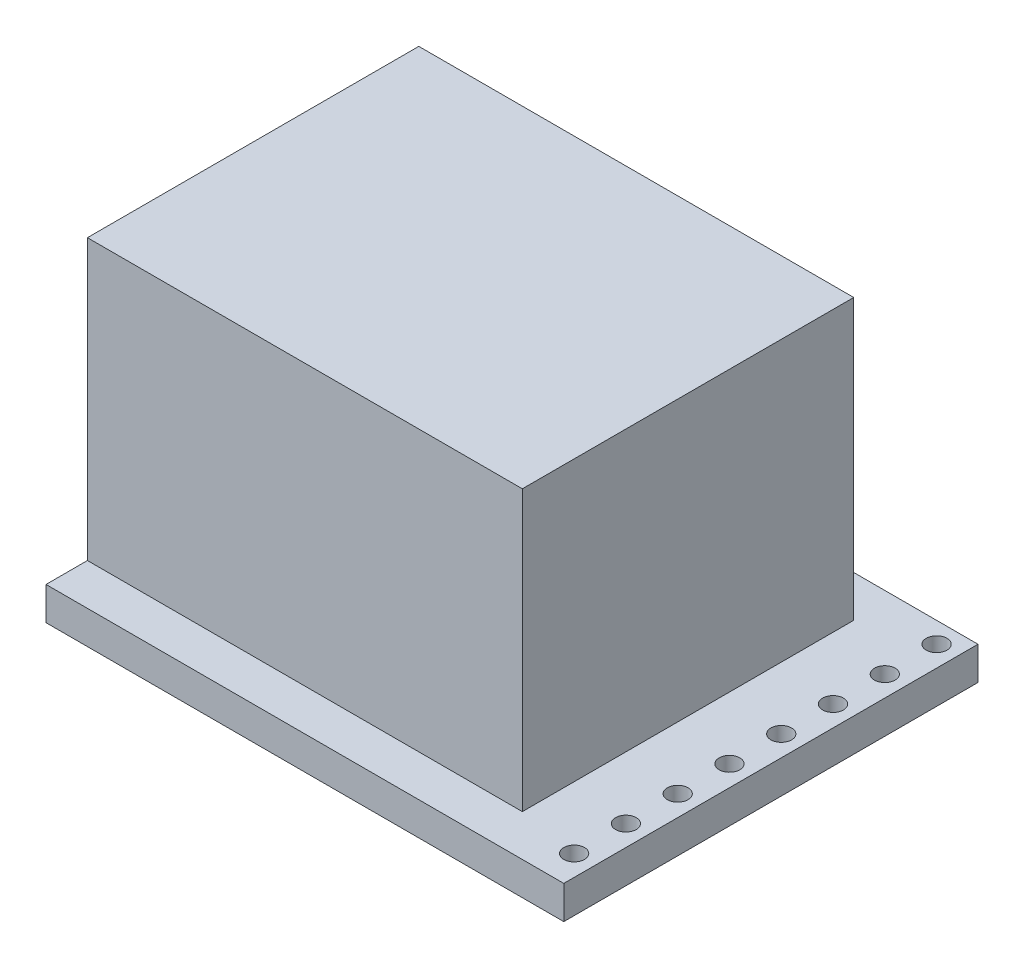
ISO-10303-21;
HEADER;
FILE_DESCRIPTION(('STEP AP214'),'2;1');
FILE_NAME('part.step','',(''),(''),'','','');
FILE_SCHEMA(('AUTOMOTIVE_DESIGN { 1 0 10303 214 1 1 1 1 }'));
ENDSEC;
DATA;
#1=APPLICATION_CONTEXT('core data for automotive mechanical design processes');
#2=APPLICATION_PROTOCOL_DEFINITION('international standard','automotive_design',2000,#1);
#3=PRODUCT_CONTEXT('',#1,'mechanical');
#4=PRODUCT('Part','Part','',(#3));
#5=PRODUCT_RELATED_PRODUCT_CATEGORY('part','',(#4));
#6=PRODUCT_DEFINITION_FORMATION('','',#4);
#7=PRODUCT_DEFINITION_CONTEXT('part definition',#1,'design');
#8=PRODUCT_DEFINITION('design','',#6,#7);
#9=PRODUCT_DEFINITION_SHAPE('','',#8);
#10=(LENGTH_UNIT() NAMED_UNIT(*) SI_UNIT(.MILLI.,.METRE.));
#11=(NAMED_UNIT(*) PLANE_ANGLE_UNIT() SI_UNIT($,.RADIAN.));
#12=(NAMED_UNIT(*) SI_UNIT($,.STERADIAN.) SOLID_ANGLE_UNIT());
#13=UNCERTAINTY_MEASURE_WITH_UNIT(LENGTH_MEASURE(1.E-05),#10,'distance_accuracy_value','');
#14=(GEOMETRIC_REPRESENTATION_CONTEXT(3) GLOBAL_UNCERTAINTY_ASSIGNED_CONTEXT((#13)) GLOBAL_UNIT_ASSIGNED_CONTEXT((#10,
#11,#12)) REPRESENTATION_CONTEXT('',''));
#15=CARTESIAN_POINT('',(0.,0.,0.));
#16=DIRECTION('',(0.,0.,1.));
#17=DIRECTION('',(1.,0.,0.));
#18=AXIS2_PLACEMENT_3D('',#15,#16,#17);
#19=CARTESIAN_POINT('',(0.,0.,0.));
#20=DIRECTION('',(0.,-1.,0.));
#21=DIRECTION('',(0.,0.,-1.));
#22=AXIS2_PLACEMENT_3D('',#19,#20,#21);
#23=PLANE('',#22);
#24=CARTESIAN_POINT('',(11.5000000000001,0.,-8.99999999999995));
#25=DIRECTION('',(0.,1.,0.));
#26=DIRECTION('',(0.,0.,1.));
#27=AXIS2_PLACEMENT_3D('',#24,#25,#26);
#28=CIRCLE('',#27,0.500000000000001);
#29=CARTESIAN_POINT('',(11.5000000000001,0.,-8.49999999999995));
#30=VERTEX_POINT('',#29);
#31=EDGE_CURVE('E212',#30,#30,#28,.T.);
#32=ORIENTED_EDGE('',*,*,#31,.F.);
#33=EDGE_LOOP('',(#32));
#34=FACE_BOUND('',#33,.T.);
#35=CARTESIAN_POINT('',(11.5000000000001,0.,-6.49999999999995));
#36=DIRECTION('',(0.,1.,0.));
#37=DIRECTION('',(0.,0.,1.));
#38=AXIS2_PLACEMENT_3D('',#35,#36,#37);
#39=CIRCLE('',#38,0.500000000000001);
#40=CARTESIAN_POINT('',(11.5000000000001,0.,-5.99999999999995));
#41=VERTEX_POINT('',#40);
#42=EDGE_CURVE('E216',#41,#41,#39,.T.);
#43=ORIENTED_EDGE('',*,*,#42,.F.);
#44=EDGE_LOOP('',(#43));
#45=FACE_BOUND('',#44,.T.);
#46=CARTESIAN_POINT('',(11.5000000000001,0.,-3.99999999999995));
#47=DIRECTION('',(0.,1.,0.));
#48=DIRECTION('',(0.,0.,1.));
#49=AXIS2_PLACEMENT_3D('',#46,#47,#48);
#50=CIRCLE('',#49,0.500000000000001);
#51=CARTESIAN_POINT('',(11.5000000000001,0.,-3.49999999999995));
#52=VERTEX_POINT('',#51);
#53=EDGE_CURVE('E219',#52,#52,#50,.T.);
#54=ORIENTED_EDGE('',*,*,#53,.F.);
#55=EDGE_LOOP('',(#54));
#56=FACE_BOUND('',#55,.T.);
#57=CARTESIAN_POINT('',(11.5000000000001,0.,-1.49999999999995));
#58=DIRECTION('',(0.,1.,0.));
#59=DIRECTION('',(0.,0.,1.));
#60=AXIS2_PLACEMENT_3D('',#57,#58,#59);
#61=CIRCLE('',#60,0.500000000000001);
#62=CARTESIAN_POINT('',(11.5000000000001,0.,-0.999999999999952));
#63=VERTEX_POINT('',#62);
#64=EDGE_CURVE('E222',#63,#63,#61,.T.);
#65=ORIENTED_EDGE('',*,*,#64,.F.);
#66=EDGE_LOOP('',(#65));
#67=FACE_BOUND('',#66,.T.);
#68=CARTESIAN_POINT('',(11.5000000000002,0.,1.00000000000005));
#69=DIRECTION('',(0.,1.,0.));
#70=DIRECTION('',(0.,0.,1.));
#71=AXIS2_PLACEMENT_3D('',#68,#69,#70);
#72=CIRCLE('',#71,0.500000000000001);
#73=CARTESIAN_POINT('',(11.5000000000002,0.,1.50000000000005));
#74=VERTEX_POINT('',#73);
#75=EDGE_CURVE('E225',#74,#74,#72,.T.);
#76=ORIENTED_EDGE('',*,*,#75,.F.);
#77=EDGE_LOOP('',(#76));
#78=FACE_BOUND('',#77,.T.);
#79=CARTESIAN_POINT('',(11.5000000000002,0.,3.50000000000005));
#80=DIRECTION('',(0.,1.,0.));
#81=DIRECTION('',(0.,0.,1.));
#82=AXIS2_PLACEMENT_3D('',#79,#80,#81);
#83=CIRCLE('',#82,0.500000000000001);
#84=CARTESIAN_POINT('',(11.5000000000002,0.,4.00000000000005));
#85=VERTEX_POINT('',#84);
#86=EDGE_CURVE('E228',#85,#85,#83,.T.);
#87=ORIENTED_EDGE('',*,*,#86,.F.);
#88=EDGE_LOOP('',(#87));
#89=FACE_BOUND('',#88,.T.);
#90=CARTESIAN_POINT('',(11.5000000000002,0.,6.00000000000005));
#91=DIRECTION('',(0.,1.,0.));
#92=DIRECTION('',(0.,0.,1.));
#93=AXIS2_PLACEMENT_3D('',#90,#91,#92);
#94=CIRCLE('',#93,0.500000000000001);
#95=CARTESIAN_POINT('',(11.5000000000002,0.,6.50000000000005));
#96=VERTEX_POINT('',#95);
#97=EDGE_CURVE('E206',#96,#96,#94,.T.);
#98=ORIENTED_EDGE('',*,*,#97,.F.);
#99=EDGE_LOOP('',(#98));
#100=FACE_BOUND('',#99,.T.);
#101=CARTESIAN_POINT('',(11.5000000000002,0.,8.50000000000005));
#102=DIRECTION('',(0.,1.,0.));
#103=DIRECTION('',(0.,0.,1.));
#104=AXIS2_PLACEMENT_3D('',#101,#102,#103);
#105=CIRCLE('',#104,0.500000000000001);
#106=CARTESIAN_POINT('',(11.5000000000002,0.,9.00000000000005));
#107=VERTEX_POINT('',#106);
#108=EDGE_CURVE('E203',#107,#107,#105,.T.);
#109=ORIENTED_EDGE('',*,*,#108,.F.);
#110=EDGE_LOOP('',(#109));
#111=FACE_BOUND('',#110,.T.);
#112=DIRECTION('',(-1.,0.,0.));
#113=VECTOR('',#112,1.);
#114=CARTESIAN_POINT('',(-12.4999999999999,0.,-8.));
#115=LINE('',#114,#113);
#116=CARTESIAN_POINT('',(8.50000000000006,0.,-8.));
#117=VERTEX_POINT('',#116);
#118=CARTESIAN_POINT('',(-12.4999999999999,0.,-8.));
#119=VERTEX_POINT('',#118);
#120=EDGE_CURVE('E302',#117,#119,#115,.T.);
#121=ORIENTED_EDGE('',*,*,#120,.F.);
#122=DIRECTION('',(0.,0.,-1.));
#123=VECTOR('',#122,1.);
#124=CARTESIAN_POINT('',(8.50000000000006,0.,-8.));
#125=LINE('',#124,#123);
#126=CARTESIAN_POINT('',(8.50000000000006,0.,8.));
#127=VERTEX_POINT('',#126);
#128=EDGE_CURVE('E311',#127,#117,#125,.T.);
#129=ORIENTED_EDGE('',*,*,#128,.F.);
#130=DIRECTION('',(1.,0.,0.));
#131=VECTOR('',#130,1.);
#132=CARTESIAN_POINT('',(-12.4999999999999,0.,8.));
#133=LINE('',#132,#131);
#134=CARTESIAN_POINT('',(-12.4999999999999,0.,8.));
#135=VERTEX_POINT('',#134);
#136=EDGE_CURVE('E283',#135,#127,#133,.T.);
#137=ORIENTED_EDGE('',*,*,#136,.F.);
#138=DIRECTION('',(0.,0.,1.));
#139=VECTOR('',#138,1.);
#140=CARTESIAN_POINT('',(-12.4999999999999,0.,10.0000000000001));
#141=LINE('',#140,#139);
#142=CARTESIAN_POINT('',(-12.4999999999999,0.,10.0000000000001));
#143=VERTEX_POINT('',#142);
#144=EDGE_CURVE('E347',#135,#143,#141,.T.);
#145=ORIENTED_EDGE('',*,*,#144,.T.);
#146=DIRECTION('',(1.,0.,0.));
#147=VECTOR('',#146,1.);
#148=CARTESIAN_POINT('',(-12.4999999999999,0.,10.0000000000001));
#149=LINE('',#148,#147);
#150=CARTESIAN_POINT('',(12.5000000000001,0.,10.0000000000001));
#151=VERTEX_POINT('',#150);
#152=EDGE_CURVE('E332',#143,#151,#149,.T.);
#153=ORIENTED_EDGE('',*,*,#152,.T.);
#154=DIRECTION('',(0.,0.,-1.));
#155=VECTOR('',#154,1.);
#156=CARTESIAN_POINT('',(12.5000000000001,0.,10.0000000000001));
#157=LINE('',#156,#155);
#158=CARTESIAN_POINT('',(12.5000000000001,0.,-9.99999999999995));
#159=VERTEX_POINT('',#158);
#160=EDGE_CURVE('E327',#151,#159,#157,.T.);
#161=ORIENTED_EDGE('',*,*,#160,.T.);
#162=DIRECTION('',(-1.,0.,0.));
#163=VECTOR('',#162,1.);
#164=CARTESIAN_POINT('',(-12.4999999999999,0.,-9.99999999999995));
#165=LINE('',#164,#163);
#166=CARTESIAN_POINT('',(-12.4999999999999,0.,-9.99999999999995));
#167=VERTEX_POINT('',#166);
#168=EDGE_CURVE('E344',#159,#167,#165,.T.);
#169=ORIENTED_EDGE('',*,*,#168,.T.);
#170=EDGE_CURVE('E348',#167,#119,#141,.T.);
#171=ORIENTED_EDGE('',*,*,#170,.T.);
#172=EDGE_LOOP('',(#121,#129,#137,#145,#153,#161,#169,#171));
#173=FACE_BOUND('',#172,.T.);
#174=ADVANCED_FACE('F45',(#34,#45,#56,#67,#78,#89,#100,#111,#173),#23,.F.);
#175=CARTESIAN_POINT('',(12.5000000000001,-1.6,10.0000000000001));
#176=DIRECTION('',(1.,0.,0.));
#177=DIRECTION('',(0.,0.,-1.));
#178=AXIS2_PLACEMENT_3D('',#175,#176,#177);
#179=PLANE('',#178);
#180=ORIENTED_EDGE('',*,*,#160,.F.);
#181=DIRECTION('',(0.,1.,0.));
#182=VECTOR('',#181,1.);
#183=CARTESIAN_POINT('',(12.5000000000001,-1.6,10.0000000000001));
#184=LINE('',#183,#182);
#185=CARTESIAN_POINT('',(12.5000000000001,-1.6,10.0000000000001));
#186=VERTEX_POINT('',#185);
#187=EDGE_CURVE('E11',#186,#151,#184,.T.);
#188=ORIENTED_EDGE('',*,*,#187,.F.);
#189=DIRECTION('',(0.,0.,-1.));
#190=VECTOR('',#189,1.);
#191=CARTESIAN_POINT('',(12.5000000000001,-1.6,10.0000000000001));
#192=LINE('',#191,#190);
#193=CARTESIAN_POINT('',(12.5000000000001,-1.6,-9.99999999999995));
#194=VERTEX_POINT('',#193);
#195=EDGE_CURVE('E328',#186,#194,#192,.T.);
#196=ORIENTED_EDGE('',*,*,#195,.T.);
#197=DIRECTION('',(0.,1.,0.));
#198=VECTOR('',#197,1.);
#199=CARTESIAN_POINT('',(12.5000000000001,-1.6,-9.99999999999995));
#200=LINE('',#199,#198);
#201=EDGE_CURVE('E341',#194,#159,#200,.T.);
#202=ORIENTED_EDGE('',*,*,#201,.T.);
#203=EDGE_LOOP('',(#180,#188,#196,#202));
#204=FACE_BOUND('',#203,.T.);
#205=ADVANCED_FACE('F47',(#204),#179,.T.);
#206=CARTESIAN_POINT('',(-12.4999999999999,-1.6,10.0000000000001));
#207=DIRECTION('',(0.,0.,1.));
#208=DIRECTION('',(1.,0.,0.));
#209=AXIS2_PLACEMENT_3D('',#206,#207,#208);
#210=PLANE('',#209);
#211=ORIENTED_EDGE('',*,*,#152,.F.);
#212=DIRECTION('',(0.,1.,0.));
#213=VECTOR('',#212,1.);
#214=CARTESIAN_POINT('',(-12.4999999999999,-1.6,10.0000000000001));
#215=LINE('',#214,#213);
#216=CARTESIAN_POINT('',(-12.4999999999999,-1.6,10.0000000000001));
#217=VERTEX_POINT('',#216);
#218=EDGE_CURVE('E54',#217,#143,#215,.T.);
#219=ORIENTED_EDGE('',*,*,#218,.F.);
#220=DIRECTION('',(1.,0.,0.));
#221=VECTOR('',#220,1.);
#222=CARTESIAN_POINT('',(-12.4999999999999,-1.6,10.0000000000001));
#223=LINE('',#222,#221);
#224=EDGE_CURVE('E338',#217,#186,#223,.T.);
#225=ORIENTED_EDGE('',*,*,#224,.T.);
#226=ORIENTED_EDGE('',*,*,#187,.T.);
#227=EDGE_LOOP('',(#211,#219,#225,#226));
#228=FACE_BOUND('',#227,.T.);
#229=ADVANCED_FACE('F410',(#228),#210,.T.);
#230=CARTESIAN_POINT('',(-12.4999999999999,-1.6,10.0000000000001));
#231=DIRECTION('',(-1.,0.,0.));
#232=DIRECTION('',(0.,0.,1.));
#233=AXIS2_PLACEMENT_3D('',#230,#231,#232);
#234=PLANE('',#233);
#235=DIRECTION('',(0.,1.,0.));
#236=VECTOR('',#235,1.);
#237=CARTESIAN_POINT('',(-12.4999999999999,3.75,6.2));
#238=LINE('',#237,#236);
#239=CARTESIAN_POINT('',(-12.4999999999999,3.75,6.2));
#240=VERTEX_POINT('',#239);
#241=CARTESIAN_POINT('',(-12.4999999999999,10.75,6.2));
#242=VERTEX_POINT('',#241);
#243=EDGE_CURVE('E259',#240,#242,#238,.T.);
#244=ORIENTED_EDGE('',*,*,#243,.F.);
#245=DIRECTION('',(0.,0.,1.));
#246=VECTOR('',#245,1.);
#247=CARTESIAN_POINT('',(-12.4999999999999,3.75,3.5));
#248=LINE('',#247,#246);
#249=CARTESIAN_POINT('',(-12.4999999999999,3.75,3.5));
#250=VERTEX_POINT('',#249);
#251=EDGE_CURVE('E237',#250,#240,#248,.T.);
#252=ORIENTED_EDGE('',*,*,#251,.F.);
#253=DIRECTION('',(0.,1.,0.));
#254=VECTOR('',#253,1.);
#255=CARTESIAN_POINT('',(-12.4999999999999,3.75,3.5));
#256=LINE('',#255,#254);
#257=CARTESIAN_POINT('',(-12.4999999999999,2.25,3.5));
#258=VERTEX_POINT('',#257);
#259=EDGE_CURVE('E276',#258,#250,#256,.T.);
#260=ORIENTED_EDGE('',*,*,#259,.F.);
#261=DIRECTION('',(0.,0.,1.));
#262=VECTOR('',#261,1.);
#263=CARTESIAN_POINT('',(-12.4999999999999,2.25,3.5));
#264=LINE('',#263,#262);
#265=CARTESIAN_POINT('',(-12.4999999999999,2.25,-3.5));
#266=VERTEX_POINT('',#265);
#267=EDGE_CURVE('E273',#266,#258,#264,.T.);
#268=ORIENTED_EDGE('',*,*,#267,.F.);
#269=DIRECTION('',(0.,-1.,0.));
#270=VECTOR('',#269,1.);
#271=CARTESIAN_POINT('',(-12.4999999999999,3.75,-3.5));
#272=LINE('',#271,#270);
#273=CARTESIAN_POINT('',(-12.4999999999999,3.75,-3.5));
#274=VERTEX_POINT('',#273);
#275=EDGE_CURVE('E270',#274,#266,#272,.T.);
#276=ORIENTED_EDGE('',*,*,#275,.F.);
#277=DIRECTION('',(0.,0.,1.));
#278=VECTOR('',#277,1.);
#279=CARTESIAN_POINT('',(-12.4999999999999,3.75,-6.2));
#280=LINE('',#279,#278);
#281=CARTESIAN_POINT('',(-12.4999999999999,3.75,-6.2));
#282=VERTEX_POINT('',#281);
#283=EDGE_CURVE('E267',#282,#274,#280,.T.);
#284=ORIENTED_EDGE('',*,*,#283,.F.);
#285=DIRECTION('',(0.,-1.,0.));
#286=VECTOR('',#285,1.);
#287=CARTESIAN_POINT('',(-12.4999999999999,3.75,-6.2));
#288=LINE('',#287,#286);
#289=CARTESIAN_POINT('',(-12.4999999999999,10.75,-6.2));
#290=VERTEX_POINT('',#289);
#291=EDGE_CURVE('E264',#290,#282,#288,.T.);
#292=ORIENTED_EDGE('',*,*,#291,.F.);
#293=DIRECTION('',(0.,0.,-1.));
#294=VECTOR('',#293,1.);
#295=CARTESIAN_POINT('',(-12.4999999999999,10.75,-6.2));
#296=LINE('',#295,#294);
#297=EDGE_CURVE('E261',#242,#290,#296,.T.);
#298=ORIENTED_EDGE('',*,*,#297,.F.);
#299=EDGE_LOOP('',(#244,#252,#260,#268,#276,#284,#292,#298));
#300=FACE_BOUND('',#299,.T.);
#301=ORIENTED_EDGE('',*,*,#170,.F.);
#302=DIRECTION('',(0.,1.,0.));
#303=VECTOR('',#302,1.);
#304=CARTESIAN_POINT('',(-12.4999999999999,-1.6,-9.99999999999995));
#305=LINE('',#304,#303);
#306=CARTESIAN_POINT('',(-12.4999999999999,-1.6,-9.99999999999995));
#307=VERTEX_POINT('',#306);
#308=EDGE_CURVE('E354',#307,#167,#305,.T.);
#309=ORIENTED_EDGE('',*,*,#308,.F.);
#310=DIRECTION('',(0.,0.,1.));
#311=VECTOR('',#310,1.);
#312=CARTESIAN_POINT('',(-12.4999999999999,-1.6,10.0000000000001));
#313=LINE('',#312,#311);
#314=EDGE_CURVE('E335',#307,#217,#313,.T.);
#315=ORIENTED_EDGE('',*,*,#314,.T.);
#316=ORIENTED_EDGE('',*,*,#218,.T.);
#317=ORIENTED_EDGE('',*,*,#144,.F.);
#318=DIRECTION('',(0.,-1.,0.));
#319=VECTOR('',#318,1.);
#320=CARTESIAN_POINT('',(-12.4999999999999,13.5,8.));
#321=LINE('',#320,#319);
#322=CARTESIAN_POINT('',(-12.4999999999999,13.5,8.));
#323=VERTEX_POINT('',#322);
#324=EDGE_CURVE('E324',#323,#135,#321,.T.);
#325=ORIENTED_EDGE('',*,*,#324,.F.);
#326=DIRECTION('',(0.,0.,1.));
#327=VECTOR('',#326,1.);
#328=CARTESIAN_POINT('',(-12.4999999999999,13.5,-8.));
#329=LINE('',#328,#327);
#330=CARTESIAN_POINT('',(-12.4999999999999,13.5,-8.));
#331=VERTEX_POINT('',#330);
#332=EDGE_CURVE('E298',#331,#323,#329,.T.);
#333=ORIENTED_EDGE('',*,*,#332,.F.);
#334=DIRECTION('',(0.,-1.,0.));
#335=VECTOR('',#334,1.);
#336=CARTESIAN_POINT('',(-12.4999999999999,13.5,-8.));
#337=LINE('',#336,#335);
#338=EDGE_CURVE('E308',#331,#119,#337,.T.);
#339=ORIENTED_EDGE('',*,*,#338,.T.);
#340=EDGE_LOOP('',(#301,#309,#315,#316,#317,#325,#333,#339));
#341=FACE_BOUND('',#340,.T.);
#342=ADVANCED_FACE('F415',(#300,#341),#234,.T.);
#343=CARTESIAN_POINT('',(-12.4999999999999,-1.6,-9.99999999999995));
#344=DIRECTION('',(0.,0.,-1.));
#345=DIRECTION('',(-1.,0.,0.));
#346=AXIS2_PLACEMENT_3D('',#343,#344,#345);
#347=PLANE('',#346);
#348=ORIENTED_EDGE('',*,*,#168,.F.);
#349=ORIENTED_EDGE('',*,*,#201,.F.);
#350=DIRECTION('',(-1.,0.,0.));
#351=VECTOR('',#350,1.);
#352=CARTESIAN_POINT('',(-12.4999999999999,-1.6,-9.99999999999995));
#353=LINE('',#352,#351);
#354=EDGE_CURVE('E331',#194,#307,#353,.T.);
#355=ORIENTED_EDGE('',*,*,#354,.T.);
#356=ORIENTED_EDGE('',*,*,#308,.T.);
#357=EDGE_LOOP('',(#348,#349,#355,#356));
#358=FACE_BOUND('',#357,.T.);
#359=ADVANCED_FACE('F387',(#358),#347,.T.);
#360=CARTESIAN_POINT('',(0.,-1.6,0.));
#361=DIRECTION('',(0.,-1.,0.));
#362=DIRECTION('',(0.,0.,-1.));
#363=AXIS2_PLACEMENT_3D('',#360,#361,#362);
#364=PLANE('',#363);
#365=CARTESIAN_POINT('',(-2.49999999999993,-1.6,-5.99999999999995));
#366=DIRECTION('',(0.,-1.,0.));
#367=DIRECTION('',(0.,0.,-1.));
#368=AXIS2_PLACEMENT_3D('',#365,#366,#367);
#369=CIRCLE('',#368,1.5);
#370=CARTESIAN_POINT('',(-2.49999999999993,-1.6,-7.49999999999995));
#371=VERTEX_POINT('',#370);
#372=EDGE_CURVE('E871',#371,#371,#369,.T.);
#373=ORIENTED_EDGE('',*,*,#372,.F.);
#374=EDGE_LOOP('',(#373));
#375=FACE_BOUND('',#374,.T.);
#376=CARTESIAN_POINT('',(-2.49999999999993,-1.6,6.00000000000006));
#377=DIRECTION('',(0.,-1.,0.));
#378=DIRECTION('',(0.,0.,-1.));
#379=AXIS2_PLACEMENT_3D('',#376,#377,#378);
#380=CIRCLE('',#379,1.5);
#381=CARTESIAN_POINT('',(-2.49999999999993,-1.6,4.50000000000006));
#382=VERTEX_POINT('',#381);
#383=EDGE_CURVE('E870',#382,#382,#380,.T.);
#384=ORIENTED_EDGE('',*,*,#383,.F.);
#385=EDGE_LOOP('',(#384));
#386=FACE_BOUND('',#385,.T.);
#387=CARTESIAN_POINT('',(6.50000000000007,-1.6,4.));
#388=DIRECTION('',(0.,-1.,0.));
#389=DIRECTION('',(0.,0.,-1.));
#390=AXIS2_PLACEMENT_3D('',#387,#388,#389);
#391=CIRCLE('',#390,2.);
#392=CARTESIAN_POINT('',(8.50000000000007,-1.6,4.));
#393=VERTEX_POINT('',#392);
#394=CARTESIAN_POINT('',(4.50000000000007,-1.6,4.));
#395=VERTEX_POINT('',#394);
#396=EDGE_CURVE('E62',#393,#395,#391,.T.);
#397=ORIENTED_EDGE('',*,*,#396,.F.);
#398=DIRECTION('',(0.,0.,1.));
#399=VECTOR('',#398,1.);
#400=CARTESIAN_POINT('',(8.50000000000007,-1.6,4.));
#401=LINE('',#400,#399);
#402=CARTESIAN_POINT('',(8.50000000000007,-1.6,-4.));
#403=VERTEX_POINT('',#402);
#404=EDGE_CURVE('E66',#403,#393,#401,.T.);
#405=ORIENTED_EDGE('',*,*,#404,.F.);
#406=CARTESIAN_POINT('',(6.50000000000007,-1.6,-4.));
#407=DIRECTION('',(0.,-1.,0.));
#408=DIRECTION('',(0.,0.,-1.));
#409=AXIS2_PLACEMENT_3D('',#406,#407,#408);
#410=CIRCLE('',#409,2.);
#411=CARTESIAN_POINT('',(4.50000000000007,-1.6,-4.));
#412=VERTEX_POINT('',#411);
#413=EDGE_CURVE('E887',#412,#403,#410,.T.);
#414=ORIENTED_EDGE('',*,*,#413,.F.);
#415=DIRECTION('',(0.,0.,-1.));
#416=VECTOR('',#415,1.);
#417=CARTESIAN_POINT('',(4.50000000000007,-1.6,4.));
#418=LINE('',#417,#416);
#419=EDGE_CURVE('E885',#395,#412,#418,.T.);
#420=ORIENTED_EDGE('',*,*,#419,.F.);
#421=EDGE_LOOP('',(#397,#405,#414,#420));
#422=FACE_BOUND('',#421,.T.);
#423=CARTESIAN_POINT('',(11.5000000000001,-1.6,-8.99999999999995));
#424=DIRECTION('',(0.,-1.,0.));
#425=DIRECTION('',(0.,0.,-1.));
#426=AXIS2_PLACEMENT_3D('',#423,#424,#425);
#427=CIRCLE('',#426,0.500000000000001);
#428=CARTESIAN_POINT('',(11.5000000000001,-1.6,-9.49999999999995));
#429=VERTEX_POINT('',#428);
#430=EDGE_CURVE('E49',#429,#429,#427,.T.);
#431=ORIENTED_EDGE('',*,*,#430,.F.);
#432=EDGE_LOOP('',(#431));
#433=FACE_BOUND('',#432,.T.);
#434=CARTESIAN_POINT('',(11.5000000000001,-1.6,-6.49999999999995));
#435=DIRECTION('',(0.,-1.,0.));
#436=DIRECTION('',(0.,0.,-1.));
#437=AXIS2_PLACEMENT_3D('',#434,#435,#436);
#438=CIRCLE('',#437,0.500000000000001);
#439=CARTESIAN_POINT('',(11.5000000000001,-1.6,-6.99999999999995));
#440=VERTEX_POINT('',#439);
#441=EDGE_CURVE('E373',#440,#440,#438,.T.);
#442=ORIENTED_EDGE('',*,*,#441,.F.);
#443=EDGE_LOOP('',(#442));
#444=FACE_BOUND('',#443,.T.);
#445=CARTESIAN_POINT('',(11.5000000000001,-1.6,-3.99999999999995));
#446=DIRECTION('',(0.,-1.,0.));
#447=DIRECTION('',(0.,0.,-1.));
#448=AXIS2_PLACEMENT_3D('',#445,#446,#447);
#449=CIRCLE('',#448,0.500000000000001);
#450=CARTESIAN_POINT('',(11.5000000000001,-1.6,-4.49999999999995));
#451=VERTEX_POINT('',#450);
#452=EDGE_CURVE('E371',#451,#451,#449,.T.);
#453=ORIENTED_EDGE('',*,*,#452,.F.);
#454=EDGE_LOOP('',(#453));
#455=FACE_BOUND('',#454,.T.);
#456=CARTESIAN_POINT('',(11.5000000000001,-1.6,-1.49999999999995));
#457=DIRECTION('',(0.,-1.,0.));
#458=DIRECTION('',(0.,0.,-1.));
#459=AXIS2_PLACEMENT_3D('',#456,#457,#458);
#460=CIRCLE('',#459,0.500000000000001);
#461=CARTESIAN_POINT('',(11.5000000000001,-1.6,-1.99999999999995));
#462=VERTEX_POINT('',#461);
#463=EDGE_CURVE('E368',#462,#462,#460,.T.);
#464=ORIENTED_EDGE('',*,*,#463,.F.);
#465=EDGE_LOOP('',(#464));
#466=FACE_BOUND('',#465,.T.);
#467=CARTESIAN_POINT('',(11.5000000000002,-1.6,1.00000000000005));
#468=DIRECTION('',(0.,-1.,0.));
#469=DIRECTION('',(0.,0.,-1.));
#470=AXIS2_PLACEMENT_3D('',#467,#468,#469);
#471=CIRCLE('',#470,0.500000000000001);
#472=CARTESIAN_POINT('',(11.5000000000002,-1.6,0.500000000000047));
#473=VERTEX_POINT('',#472);
#474=EDGE_CURVE('E365',#473,#473,#471,.T.);
#475=ORIENTED_EDGE('',*,*,#474,.F.);
#476=EDGE_LOOP('',(#475));
#477=FACE_BOUND('',#476,.T.);
#478=CARTESIAN_POINT('',(11.5000000000002,-1.6,3.50000000000005));
#479=DIRECTION('',(0.,-1.,0.));
#480=DIRECTION('',(0.,0.,-1.));
#481=AXIS2_PLACEMENT_3D('',#478,#479,#480);
#482=CIRCLE('',#481,0.500000000000001);
#483=CARTESIAN_POINT('',(11.5000000000002,-1.6,3.00000000000005));
#484=VERTEX_POINT('',#483);
#485=EDGE_CURVE('E362',#484,#484,#482,.T.);
#486=ORIENTED_EDGE('',*,*,#485,.F.);
#487=EDGE_LOOP('',(#486));
#488=FACE_BOUND('',#487,.T.);
#489=CARTESIAN_POINT('',(11.5000000000002,-1.6,6.00000000000005));
#490=DIRECTION('',(0.,-1.,0.));
#491=DIRECTION('',(0.,0.,-1.));
#492=AXIS2_PLACEMENT_3D('',#489,#490,#491);
#493=CIRCLE('',#492,0.500000000000001);
#494=CARTESIAN_POINT('',(11.5000000000002,-1.6,5.50000000000005));
#495=VERTEX_POINT('',#494);
#496=EDGE_CURVE('E359',#495,#495,#493,.T.);
#497=ORIENTED_EDGE('',*,*,#496,.F.);
#498=EDGE_LOOP('',(#497));
#499=FACE_BOUND('',#498,.T.);
#500=CARTESIAN_POINT('',(11.5000000000002,-1.6,8.50000000000005));
#501=DIRECTION('',(0.,-1.,0.));
#502=DIRECTION('',(0.,0.,-1.));
#503=AXIS2_PLACEMENT_3D('',#500,#501,#502);
#504=CIRCLE('',#503,0.500000000000001);
#505=CARTESIAN_POINT('',(11.5000000000002,-1.6,8.00000000000005));
#506=VERTEX_POINT('',#505);
#507=EDGE_CURVE('E215',#506,#506,#504,.T.);
#508=ORIENTED_EDGE('',*,*,#507,.F.);
#509=EDGE_LOOP('',(#508));
#510=FACE_BOUND('',#509,.T.);
#511=ORIENTED_EDGE('',*,*,#195,.F.);
#512=ORIENTED_EDGE('',*,*,#224,.F.);
#513=ORIENTED_EDGE('',*,*,#314,.F.);
#514=ORIENTED_EDGE('',*,*,#354,.F.);
#515=EDGE_LOOP('',(#511,#512,#513,#514));
#516=FACE_BOUND('',#515,.T.);
#517=ADVANCED_FACE('F383',(#375,#386,#422,#433,#444,#455,#466,#477,#488,#499,#510,#516),#364,.T.);
#518=CARTESIAN_POINT('',(-12.4999999999999,13.5,8.));
#519=DIRECTION('',(0.,0.,-1.));
#520=DIRECTION('',(-1.,0.,0.));
#521=AXIS2_PLACEMENT_3D('',#518,#519,#520);
#522=PLANE('',#521);
#523=ORIENTED_EDGE('',*,*,#136,.T.);
#524=DIRECTION('',(0.,-1.,0.));
#525=VECTOR('',#524,1.);
#526=CARTESIAN_POINT('',(8.50000000000006,13.5,8.));
#527=LINE('',#526,#525);
#528=CARTESIAN_POINT('',(8.50000000000006,13.5,8.));
#529=VERTEX_POINT('',#528);
#530=EDGE_CURVE('E321',#529,#127,#527,.T.);
#531=ORIENTED_EDGE('',*,*,#530,.F.);
#532=DIRECTION('',(1.,0.,0.));
#533=VECTOR('',#532,1.);
#534=CARTESIAN_POINT('',(-12.4999999999999,13.5,8.));
#535=LINE('',#534,#533);
#536=EDGE_CURVE('E301',#323,#529,#535,.T.);
#537=ORIENTED_EDGE('',*,*,#536,.F.);
#538=ORIENTED_EDGE('',*,*,#324,.T.);
#539=EDGE_LOOP('',(#523,#531,#537,#538));
#540=FACE_BOUND('',#539,.T.);
#541=ADVANCED_FACE('F386',(#540),#522,.F.);
#542=CARTESIAN_POINT('',(8.50000000000006,13.5,-8.));
#543=DIRECTION('',(-1.,0.,0.));
#544=DIRECTION('',(0.,0.,1.));
#545=AXIS2_PLACEMENT_3D('',#542,#543,#544);
#546=PLANE('',#545);
#547=ORIENTED_EDGE('',*,*,#128,.T.);
#548=DIRECTION('',(0.,-1.,0.));
#549=VECTOR('',#548,1.);
#550=CARTESIAN_POINT('',(8.50000000000006,13.5,-8.));
#551=LINE('',#550,#549);
#552=CARTESIAN_POINT('',(8.50000000000006,13.5,-8.));
#553=VERTEX_POINT('',#552);
#554=EDGE_CURVE('E318',#553,#117,#551,.T.);
#555=ORIENTED_EDGE('',*,*,#554,.F.);
#556=DIRECTION('',(0.,0.,-1.));
#557=VECTOR('',#556,1.);
#558=CARTESIAN_POINT('',(8.50000000000006,13.5,-8.));
#559=LINE('',#558,#557);
#560=EDGE_CURVE('E304',#529,#553,#559,.T.);
#561=ORIENTED_EDGE('',*,*,#560,.F.);
#562=ORIENTED_EDGE('',*,*,#530,.T.);
#563=EDGE_LOOP('',(#547,#555,#561,#562));
#564=FACE_BOUND('',#563,.T.);
#565=ADVANCED_FACE('F432',(#564),#546,.F.);
#566=CARTESIAN_POINT('',(-12.4999999999999,13.5,-8.));
#567=DIRECTION('',(0.,0.,1.));
#568=DIRECTION('',(1.,0.,0.));
#569=AXIS2_PLACEMENT_3D('',#566,#567,#568);
#570=PLANE('',#569);
#571=ORIENTED_EDGE('',*,*,#120,.T.);
#572=ORIENTED_EDGE('',*,*,#338,.F.);
#573=DIRECTION('',(-1.,0.,0.));
#574=VECTOR('',#573,1.);
#575=CARTESIAN_POINT('',(-12.4999999999999,13.5,-8.));
#576=LINE('',#575,#574);
#577=EDGE_CURVE('E306',#553,#331,#576,.T.);
#578=ORIENTED_EDGE('',*,*,#577,.F.);
#579=ORIENTED_EDGE('',*,*,#554,.T.);
#580=EDGE_LOOP('',(#571,#572,#578,#579));
#581=FACE_BOUND('',#580,.T.);
#582=ADVANCED_FACE('F429',(#581),#570,.F.);
#583=CARTESIAN_POINT('',(0.,13.5,0.));
#584=DIRECTION('',(0.,1.,0.));
#585=DIRECTION('',(0.,0.,1.));
#586=AXIS2_PLACEMENT_3D('',#583,#584,#585);
#587=PLANE('',#586);
#588=ORIENTED_EDGE('',*,*,#332,.T.);
#589=ORIENTED_EDGE('',*,*,#536,.T.);
#590=ORIENTED_EDGE('',*,*,#560,.T.);
#591=ORIENTED_EDGE('',*,*,#577,.T.);
#592=EDGE_LOOP('',(#588,#589,#590,#591));
#593=FACE_BOUND('',#592,.T.);
#594=ADVANCED_FACE('F425',(#593),#587,.T.);
#595=CARTESIAN_POINT('',(1.00000000000007,3.75,6.2));
#596=DIRECTION('',(0.,0.,1.));
#597=DIRECTION('',(0.,-1.,0.));
#598=AXIS2_PLACEMENT_3D('',#595,#596,#597);
#599=PLANE('',#598);
#600=ORIENTED_EDGE('',*,*,#243,.T.);
#601=DIRECTION('',(-1.,0.,0.));
#602=VECTOR('',#601,1.);
#603=CARTESIAN_POINT('',(1.00000000000007,10.75,6.2));
#604=LINE('',#603,#602);
#605=CARTESIAN_POINT('',(1.00000000000007,10.75,6.2));
#606=VERTEX_POINT('',#605);
#607=EDGE_CURVE('E258',#606,#242,#604,.T.);
#608=ORIENTED_EDGE('',*,*,#607,.F.);
#609=DIRECTION('',(0.,1.,0.));
#610=VECTOR('',#609,1.);
#611=CARTESIAN_POINT('',(1.00000000000007,3.75,6.2));
#612=LINE('',#611,#610);
#613=CARTESIAN_POINT('',(1.00000000000007,3.75,6.2));
#614=VERTEX_POINT('',#613);
#615=EDGE_CURVE('E233',#614,#606,#612,.T.);
#616=ORIENTED_EDGE('',*,*,#615,.F.);
#617=DIRECTION('',(-1.,0.,0.));
#618=VECTOR('',#617,1.);
#619=CARTESIAN_POINT('',(1.00000000000007,3.75,6.2));
#620=LINE('',#619,#618);
#621=EDGE_CURVE('E281',#614,#240,#620,.T.);
#622=ORIENTED_EDGE('',*,*,#621,.T.);
#623=EDGE_LOOP('',(#600,#608,#616,#622));
#624=FACE_BOUND('',#623,.T.);
#625=ADVANCED_FACE('F487',(#624),#599,.F.);
#626=CARTESIAN_POINT('',(1.00000000000007,3.75,3.5));
#627=DIRECTION('',(0.,-1.,0.));
#628=DIRECTION('',(0.,0.,-1.));
#629=AXIS2_PLACEMENT_3D('',#626,#627,#628);
#630=PLANE('',#629);
#631=ORIENTED_EDGE('',*,*,#251,.T.);
#632=ORIENTED_EDGE('',*,*,#621,.F.);
#633=DIRECTION('',(0.,0.,1.));
#634=VECTOR('',#633,1.);
#635=CARTESIAN_POINT('',(1.00000000000007,3.75,3.5));
#636=LINE('',#635,#634);
#637=CARTESIAN_POINT('',(1.00000000000007,3.75,3.5));
#638=VERTEX_POINT('',#637);
#639=EDGE_CURVE('E255',#638,#614,#636,.T.);
#640=ORIENTED_EDGE('',*,*,#639,.F.);
#641=DIRECTION('',(-1.,0.,0.));
#642=VECTOR('',#641,1.);
#643=CARTESIAN_POINT('',(1.00000000000007,3.75,3.5));
#644=LINE('',#643,#642);
#645=EDGE_CURVE('E284',#638,#250,#644,.T.);
#646=ORIENTED_EDGE('',*,*,#645,.T.);
#647=EDGE_LOOP('',(#631,#632,#640,#646));
#648=FACE_BOUND('',#647,.T.);
#649=ADVANCED_FACE('F495',(#648),#630,.F.);
#650=CARTESIAN_POINT('',(1.00000000000007,3.75,3.5));
#651=DIRECTION('',(0.,0.,1.));
#652=DIRECTION('',(0.,-1.,0.));
#653=AXIS2_PLACEMENT_3D('',#650,#651,#652);
#654=PLANE('',#653);
#655=ORIENTED_EDGE('',*,*,#259,.T.);
#656=ORIENTED_EDGE('',*,*,#645,.F.);
#657=DIRECTION('',(0.,1.,0.));
#658=VECTOR('',#657,1.);
#659=CARTESIAN_POINT('',(1.00000000000007,3.75,3.5));
#660=LINE('',#659,#658);
#661=CARTESIAN_POINT('',(1.00000000000007,2.25,3.5));
#662=VERTEX_POINT('',#661);
#663=EDGE_CURVE('E252',#662,#638,#660,.T.);
#664=ORIENTED_EDGE('',*,*,#663,.F.);
#665=DIRECTION('',(-1.,0.,0.));
#666=VECTOR('',#665,1.);
#667=CARTESIAN_POINT('',(1.00000000000007,2.25,3.5));
#668=LINE('',#667,#666);
#669=EDGE_CURVE('E286',#662,#258,#668,.T.);
#670=ORIENTED_EDGE('',*,*,#669,.T.);
#671=EDGE_LOOP('',(#655,#656,#664,#670));
#672=FACE_BOUND('',#671,.T.);
#673=ADVANCED_FACE('F505',(#672),#654,.F.);
#674=CARTESIAN_POINT('',(1.00000000000007,2.25,3.5));
#675=DIRECTION('',(0.,-1.,0.));
#676=DIRECTION('',(0.,0.,-1.));
#677=AXIS2_PLACEMENT_3D('',#674,#675,#676);
#678=PLANE('',#677);
#679=ORIENTED_EDGE('',*,*,#267,.T.);
#680=ORIENTED_EDGE('',*,*,#669,.F.);
#681=DIRECTION('',(0.,0.,1.));
#682=VECTOR('',#681,1.);
#683=CARTESIAN_POINT('',(1.00000000000007,2.25,3.5));
#684=LINE('',#683,#682);
#685=CARTESIAN_POINT('',(1.00000000000007,2.25,-3.5));
#686=VERTEX_POINT('',#685);
#687=EDGE_CURVE('E249',#686,#662,#684,.T.);
#688=ORIENTED_EDGE('',*,*,#687,.F.);
#689=DIRECTION('',(-1.,0.,0.));
#690=VECTOR('',#689,1.);
#691=CARTESIAN_POINT('',(1.00000000000007,2.25,-3.5));
#692=LINE('',#691,#690);
#693=EDGE_CURVE('E288',#686,#266,#692,.T.);
#694=ORIENTED_EDGE('',*,*,#693,.T.);
#695=EDGE_LOOP('',(#679,#680,#688,#694));
#696=FACE_BOUND('',#695,.T.);
#697=ADVANCED_FACE('F513',(#696),#678,.F.);
#698=CARTESIAN_POINT('',(1.00000000000007,3.75,-3.5));
#699=DIRECTION('',(0.,0.,-1.));
#700=DIRECTION('',(0.,1.,0.));
#701=AXIS2_PLACEMENT_3D('',#698,#699,#700);
#702=PLANE('',#701);
#703=ORIENTED_EDGE('',*,*,#275,.T.);
#704=ORIENTED_EDGE('',*,*,#693,.F.);
#705=DIRECTION('',(0.,-1.,0.));
#706=VECTOR('',#705,1.);
#707=CARTESIAN_POINT('',(1.00000000000007,3.75,-3.5));
#708=LINE('',#707,#706);
#709=CARTESIAN_POINT('',(1.00000000000007,3.75,-3.5));
#710=VERTEX_POINT('',#709);
#711=EDGE_CURVE('E246',#710,#686,#708,.T.);
#712=ORIENTED_EDGE('',*,*,#711,.F.);
#713=DIRECTION('',(-1.,0.,0.));
#714=VECTOR('',#713,1.);
#715=CARTESIAN_POINT('',(1.00000000000007,3.75,-3.5));
#716=LINE('',#715,#714);
#717=EDGE_CURVE('E290',#710,#274,#716,.T.);
#718=ORIENTED_EDGE('',*,*,#717,.T.);
#719=EDGE_LOOP('',(#703,#704,#712,#718));
#720=FACE_BOUND('',#719,.T.);
#721=ADVANCED_FACE('F516',(#720),#702,.F.);
#722=CARTESIAN_POINT('',(1.00000000000007,3.75,-6.2));
#723=DIRECTION('',(0.,-1.,0.));
#724=DIRECTION('',(0.,0.,-1.));
#725=AXIS2_PLACEMENT_3D('',#722,#723,#724);
#726=PLANE('',#725);
#727=ORIENTED_EDGE('',*,*,#283,.T.);
#728=ORIENTED_EDGE('',*,*,#717,.F.);
#729=DIRECTION('',(0.,0.,1.));
#730=VECTOR('',#729,1.);
#731=CARTESIAN_POINT('',(1.00000000000007,3.75,-6.2));
#732=LINE('',#731,#730);
#733=CARTESIAN_POINT('',(1.00000000000007,3.75,-6.2));
#734=VERTEX_POINT('',#733);
#735=EDGE_CURVE('E243',#734,#710,#732,.T.);
#736=ORIENTED_EDGE('',*,*,#735,.F.);
#737=DIRECTION('',(-1.,0.,0.));
#738=VECTOR('',#737,1.);
#739=CARTESIAN_POINT('',(1.00000000000007,3.75,-6.2));
#740=LINE('',#739,#738);
#741=EDGE_CURVE('E292',#734,#282,#740,.T.);
#742=ORIENTED_EDGE('',*,*,#741,.T.);
#743=EDGE_LOOP('',(#727,#728,#736,#742));
#744=FACE_BOUND('',#743,.T.);
#745=ADVANCED_FACE('F524',(#744),#726,.F.);
#746=CARTESIAN_POINT('',(1.00000000000007,3.75,-6.2));
#747=DIRECTION('',(0.,0.,-1.));
#748=DIRECTION('',(-1.,0.,0.));
#749=AXIS2_PLACEMENT_3D('',#746,#747,#748);
#750=PLANE('',#749);
#751=ORIENTED_EDGE('',*,*,#291,.T.);
#752=ORIENTED_EDGE('',*,*,#741,.F.);
#753=DIRECTION('',(0.,-1.,0.));
#754=VECTOR('',#753,1.);
#755=CARTESIAN_POINT('',(1.00000000000007,3.75,-6.2));
#756=LINE('',#755,#754);
#757=CARTESIAN_POINT('',(1.00000000000007,10.75,-6.2));
#758=VERTEX_POINT('',#757);
#759=EDGE_CURVE('E240',#758,#734,#756,.T.);
#760=ORIENTED_EDGE('',*,*,#759,.F.);
#761=DIRECTION('',(-1.,0.,0.));
#762=VECTOR('',#761,1.);
#763=CARTESIAN_POINT('',(1.00000000000007,10.75,-6.2));
#764=LINE('',#763,#762);
#765=EDGE_CURVE('E294',#758,#290,#764,.T.);
#766=ORIENTED_EDGE('',*,*,#765,.T.);
#767=EDGE_LOOP('',(#751,#752,#760,#766));
#768=FACE_BOUND('',#767,.T.);
#769=ADVANCED_FACE('F527',(#768),#750,.F.);
#770=CARTESIAN_POINT('',(1.00000000000007,10.75,-6.2));
#771=DIRECTION('',(0.,1.,0.));
#772=DIRECTION('',(0.,0.,1.));
#773=AXIS2_PLACEMENT_3D('',#770,#771,#772);
#774=PLANE('',#773);
#775=ORIENTED_EDGE('',*,*,#297,.T.);
#776=ORIENTED_EDGE('',*,*,#765,.F.);
#777=DIRECTION('',(0.,0.,-1.));
#778=VECTOR('',#777,1.);
#779=CARTESIAN_POINT('',(1.00000000000007,10.75,-6.2));
#780=LINE('',#779,#778);
#781=EDGE_CURVE('E236',#606,#758,#780,.T.);
#782=ORIENTED_EDGE('',*,*,#781,.F.);
#783=ORIENTED_EDGE('',*,*,#607,.T.);
#784=EDGE_LOOP('',(#775,#776,#782,#783));
#785=FACE_BOUND('',#784,.T.);
#786=ADVANCED_FACE('F539',(#785),#774,.F.);
#787=CARTESIAN_POINT('',(1.00000000000007,0.,0.));
#788=DIRECTION('',(1.,0.,0.));
#789=DIRECTION('',(0.,0.,-1.));
#790=AXIS2_PLACEMENT_3D('',#787,#788,#789);
#791=PLANE('',#790);
#792=ORIENTED_EDGE('',*,*,#615,.T.);
#793=ORIENTED_EDGE('',*,*,#781,.T.);
#794=ORIENTED_EDGE('',*,*,#759,.T.);
#795=ORIENTED_EDGE('',*,*,#735,.T.);
#796=ORIENTED_EDGE('',*,*,#711,.T.);
#797=ORIENTED_EDGE('',*,*,#687,.T.);
#798=ORIENTED_EDGE('',*,*,#663,.T.);
#799=ORIENTED_EDGE('',*,*,#639,.T.);
#800=EDGE_LOOP('',(#792,#793,#794,#795,#796,#797,#798,#799));
#801=FACE_BOUND('',#800,.T.);
#802=ADVANCED_FACE('F535',(#801),#791,.F.);
#803=CARTESIAN_POINT('',(11.5000000000002,-13.5,8.50000000000005));
#804=DIRECTION('',(0.,1.,0.));
#805=DIRECTION('',(0.,0.,1.));
#806=AXIS2_PLACEMENT_3D('',#803,#804,#805);
#807=CYLINDRICAL_SURFACE('',#806,0.500000000000001);
#808=ORIENTED_EDGE('',*,*,#507,.T.);
#809=EDGE_LOOP('',(#808));
#810=FACE_BOUND('',#809,.T.);
#811=ORIENTED_EDGE('',*,*,#108,.T.);
#812=EDGE_LOOP('',(#811));
#813=FACE_BOUND('',#812,.T.);
#814=ADVANCED_FACE('F538',(#810,#813),#807,.F.);
#815=CARTESIAN_POINT('',(11.5000000000002,-13.5,6.00000000000005));
#816=DIRECTION('',(0.,1.,0.));
#817=DIRECTION('',(0.,0.,1.));
#818=AXIS2_PLACEMENT_3D('',#815,#816,#817);
#819=CYLINDRICAL_SURFACE('',#818,0.500000000000001);
#820=ORIENTED_EDGE('',*,*,#496,.T.);
#821=EDGE_LOOP('',(#820));
#822=FACE_BOUND('',#821,.T.);
#823=ORIENTED_EDGE('',*,*,#97,.T.);
#824=EDGE_LOOP('',(#823));
#825=FACE_BOUND('',#824,.T.);
#826=ADVANCED_FACE('F700',(#822,#825),#819,.F.);
#827=CARTESIAN_POINT('',(11.5000000000002,-13.5,3.50000000000005));
#828=DIRECTION('',(0.,1.,0.));
#829=DIRECTION('',(0.,0.,1.));
#830=AXIS2_PLACEMENT_3D('',#827,#828,#829);
#831=CYLINDRICAL_SURFACE('',#830,0.500000000000001);
#832=ORIENTED_EDGE('',*,*,#485,.T.);
#833=EDGE_LOOP('',(#832));
#834=FACE_BOUND('',#833,.T.);
#835=ORIENTED_EDGE('',*,*,#86,.T.);
#836=EDGE_LOOP('',(#835));
#837=FACE_BOUND('',#836,.T.);
#838=ADVANCED_FACE('F692',(#834,#837),#831,.F.);
#839=CARTESIAN_POINT('',(11.5000000000002,-13.5,1.00000000000005));
#840=DIRECTION('',(0.,1.,0.));
#841=DIRECTION('',(0.,0.,1.));
#842=AXIS2_PLACEMENT_3D('',#839,#840,#841);
#843=CYLINDRICAL_SURFACE('',#842,0.500000000000001);
#844=ORIENTED_EDGE('',*,*,#474,.T.);
#845=EDGE_LOOP('',(#844));
#846=FACE_BOUND('',#845,.T.);
#847=ORIENTED_EDGE('',*,*,#75,.T.);
#848=EDGE_LOOP('',(#847));
#849=FACE_BOUND('',#848,.T.);
#850=ADVANCED_FACE('F684',(#846,#849),#843,.F.);
#851=CARTESIAN_POINT('',(11.5000000000001,-13.5,-1.49999999999995));
#852=DIRECTION('',(0.,1.,0.));
#853=DIRECTION('',(0.,0.,1.));
#854=AXIS2_PLACEMENT_3D('',#851,#852,#853);
#855=CYLINDRICAL_SURFACE('',#854,0.500000000000001);
#856=ORIENTED_EDGE('',*,*,#463,.T.);
#857=EDGE_LOOP('',(#856));
#858=FACE_BOUND('',#857,.T.);
#859=ORIENTED_EDGE('',*,*,#64,.T.);
#860=EDGE_LOOP('',(#859));
#861=FACE_BOUND('',#860,.T.);
#862=ADVANCED_FACE('F676',(#858,#861),#855,.F.);
#863=CARTESIAN_POINT('',(11.5000000000001,-13.5,-3.99999999999995));
#864=DIRECTION('',(0.,1.,0.));
#865=DIRECTION('',(0.,0.,1.));
#866=AXIS2_PLACEMENT_3D('',#863,#864,#865);
#867=CYLINDRICAL_SURFACE('',#866,0.500000000000001);
#868=ORIENTED_EDGE('',*,*,#452,.T.);
#869=EDGE_LOOP('',(#868));
#870=FACE_BOUND('',#869,.T.);
#871=ORIENTED_EDGE('',*,*,#53,.T.);
#872=EDGE_LOOP('',(#871));
#873=FACE_BOUND('',#872,.T.);
#874=ADVANCED_FACE('F669',(#870,#873),#867,.F.);
#875=CARTESIAN_POINT('',(11.5000000000001,-13.5,-6.49999999999995));
#876=DIRECTION('',(0.,1.,0.));
#877=DIRECTION('',(0.,0.,1.));
#878=AXIS2_PLACEMENT_3D('',#875,#876,#877);
#879=CYLINDRICAL_SURFACE('',#878,0.500000000000001);
#880=ORIENTED_EDGE('',*,*,#441,.T.);
#881=EDGE_LOOP('',(#880));
#882=FACE_BOUND('',#881,.T.);
#883=ORIENTED_EDGE('',*,*,#42,.T.);
#884=EDGE_LOOP('',(#883));
#885=FACE_BOUND('',#884,.T.);
#886=ADVANCED_FACE('F662',(#882,#885),#879,.F.);
#887=CARTESIAN_POINT('',(11.5000000000001,-13.5,-8.99999999999995));
#888=DIRECTION('',(0.,1.,0.));
#889=DIRECTION('',(0.,0.,1.));
#890=AXIS2_PLACEMENT_3D('',#887,#888,#889);
#891=CYLINDRICAL_SURFACE('',#890,0.500000000000001);
#892=ORIENTED_EDGE('',*,*,#430,.T.);
#893=EDGE_LOOP('',(#892));
#894=FACE_BOUND('',#893,.T.);
#895=ORIENTED_EDGE('',*,*,#31,.T.);
#896=EDGE_LOOP('',(#895));
#897=FACE_BOUND('',#896,.T.);
#898=ADVANCED_FACE('F380',(#894,#897),#891,.F.);
#899=CARTESIAN_POINT('',(6.50000000000007,-3.6,4.));
#900=DIRECTION('',(0.,1.,0.));
#901=DIRECTION('',(0.,0.,1.));
#902=AXIS2_PLACEMENT_3D('',#899,#900,#901);
#903=CYLINDRICAL_SURFACE('',#902,2.);
#904=ORIENTED_EDGE('',*,*,#396,.T.);
#905=DIRECTION('',(0.,1.,0.));
#906=VECTOR('',#905,1.);
#907=CARTESIAN_POINT('',(4.50000000000007,-3.6,4.));
#908=LINE('',#907,#906);
#909=CARTESIAN_POINT('',(4.50000000000007,-3.6,4.));
#910=VERTEX_POINT('',#909);
#911=EDGE_CURVE('E186',#910,#395,#908,.T.);
#912=ORIENTED_EDGE('',*,*,#911,.F.);
#913=CARTESIAN_POINT('',(6.50000000000007,-3.6,4.));
#914=DIRECTION('',(0.,-1.,0.));
#915=DIRECTION('',(0.,0.,-1.));
#916=AXIS2_PLACEMENT_3D('',#913,#914,#915);
#917=CIRCLE('',#916,2.);
#918=CARTESIAN_POINT('',(8.50000000000007,-3.6,4.));
#919=VERTEX_POINT('',#918);
#920=EDGE_CURVE('E192',#919,#910,#917,.T.);
#921=ORIENTED_EDGE('',*,*,#920,.F.);
#922=DIRECTION('',(0.,1.,0.));
#923=VECTOR('',#922,1.);
#924=CARTESIAN_POINT('',(8.50000000000007,-3.6,4.));
#925=LINE('',#924,#923);
#926=EDGE_CURVE('E883',#919,#393,#925,.T.);
#927=ORIENTED_EDGE('',*,*,#926,.T.);
#928=EDGE_LOOP('',(#904,#912,#921,#927));
#929=FACE_BOUND('',#928,.T.);
#930=ADVANCED_FACE('F202',(#929),#903,.T.);
#931=CARTESIAN_POINT('',(4.50000000000007,-3.6,4.));
#932=DIRECTION('',(1.,0.,0.));
#933=DIRECTION('',(0.,0.,-1.));
#934=AXIS2_PLACEMENT_3D('',#931,#932,#933);
#935=PLANE('',#934);
#936=ORIENTED_EDGE('',*,*,#419,.T.);
#937=DIRECTION('',(0.,1.,0.));
#938=VECTOR('',#937,1.);
#939=CARTESIAN_POINT('',(4.50000000000007,-3.6,-4.));
#940=LINE('',#939,#938);
#941=CARTESIAN_POINT('',(4.50000000000007,-3.6,-4.));
#942=VERTEX_POINT('',#941);
#943=EDGE_CURVE('E188',#942,#412,#940,.T.);
#944=ORIENTED_EDGE('',*,*,#943,.F.);
#945=DIRECTION('',(0.,0.,-1.));
#946=VECTOR('',#945,1.);
#947=CARTESIAN_POINT('',(4.50000000000007,-3.6,4.));
#948=LINE('',#947,#946);
#949=EDGE_CURVE('E181',#910,#942,#948,.T.);
#950=ORIENTED_EDGE('',*,*,#949,.F.);
#951=ORIENTED_EDGE('',*,*,#911,.T.);
#952=EDGE_LOOP('',(#936,#944,#950,#951));
#953=FACE_BOUND('',#952,.T.);
#954=ADVANCED_FACE('F184',(#953),#935,.F.);
#955=CARTESIAN_POINT('',(6.50000000000007,-3.6,-4.));
#956=DIRECTION('',(0.,1.,0.));
#957=DIRECTION('',(0.,0.,1.));
#958=AXIS2_PLACEMENT_3D('',#955,#956,#957);
#959=CYLINDRICAL_SURFACE('',#958,2.);
#960=ORIENTED_EDGE('',*,*,#413,.T.);
#961=DIRECTION('',(0.,1.,0.));
#962=VECTOR('',#961,1.);
#963=CARTESIAN_POINT('',(8.50000000000007,-3.6,-4.));
#964=LINE('',#963,#962);
#965=CARTESIAN_POINT('',(8.50000000000007,-3.6,-4.));
#966=VERTEX_POINT('',#965);
#967=EDGE_CURVE('E208',#966,#403,#964,.T.);
#968=ORIENTED_EDGE('',*,*,#967,.F.);
#969=CARTESIAN_POINT('',(6.50000000000007,-3.6,-4.));
#970=DIRECTION('',(0.,-1.,0.));
#971=DIRECTION('',(0.,0.,-1.));
#972=AXIS2_PLACEMENT_3D('',#969,#970,#971);
#973=CIRCLE('',#972,2.);
#974=EDGE_CURVE('E191',#942,#966,#973,.T.);
#975=ORIENTED_EDGE('',*,*,#974,.F.);
#976=ORIENTED_EDGE('',*,*,#943,.T.);
#977=EDGE_LOOP('',(#960,#968,#975,#976));
#978=FACE_BOUND('',#977,.T.);
#979=ADVANCED_FACE('F559',(#978),#959,.T.);
#980=CARTESIAN_POINT('',(8.50000000000007,-3.6,4.));
#981=DIRECTION('',(-1.,0.,0.));
#982=DIRECTION('',(0.,0.,1.));
#983=AXIS2_PLACEMENT_3D('',#980,#981,#982);
#984=PLANE('',#983);
#985=ORIENTED_EDGE('',*,*,#404,.T.);
#986=ORIENTED_EDGE('',*,*,#926,.F.);
#987=DIRECTION('',(0.,0.,1.));
#988=VECTOR('',#987,1.);
#989=CARTESIAN_POINT('',(8.50000000000007,-3.6,4.));
#990=LINE('',#989,#988);
#991=EDGE_CURVE('E197',#966,#919,#990,.T.);
#992=ORIENTED_EDGE('',*,*,#991,.F.);
#993=ORIENTED_EDGE('',*,*,#967,.T.);
#994=EDGE_LOOP('',(#985,#986,#992,#993));
#995=FACE_BOUND('',#994,.T.);
#996=ADVANCED_FACE('F568',(#995),#984,.F.);
#997=CARTESIAN_POINT('',(6.50000000000007,-3.6,4.));
#998=DIRECTION('',(0.,-1.,0.));
#999=DIRECTION('',(0.,0.,-1.));
#1000=AXIS2_PLACEMENT_3D('',#997,#998,#999);
#1001=PLANE('',#1000);
#1002=ORIENTED_EDGE('',*,*,#920,.T.);
#1003=ORIENTED_EDGE('',*,*,#949,.T.);
#1004=ORIENTED_EDGE('',*,*,#974,.T.);
#1005=ORIENTED_EDGE('',*,*,#991,.T.);
#1006=EDGE_LOOP('',(#1002,#1003,#1004,#1005));
#1007=FACE_BOUND('',#1006,.T.);
#1008=ADVANCED_FACE('F195',(#1007),#1001,.T.);
#1009=CARTESIAN_POINT('',(-2.49999999999993,-3.6,6.00000000000006));
#1010=DIRECTION('',(0.,1.,0.));
#1011=DIRECTION('',(0.,0.,1.));
#1012=AXIS2_PLACEMENT_3D('',#1009,#1010,#1011);
#1013=CYLINDRICAL_SURFACE('',#1012,1.5);
#1014=CARTESIAN_POINT('',(-2.49999999999993,-3.6,6.00000000000006));
#1015=DIRECTION('',(0.,-1.,0.));
#1016=DIRECTION('',(0.,0.,-1.));
#1017=AXIS2_PLACEMENT_3D('',#1014,#1015,#1016);
#1018=CIRCLE('',#1017,1.5);
#1019=CARTESIAN_POINT('',(-2.49999999999993,-3.6,4.50000000000006));
#1020=VERTEX_POINT('',#1019);
#1021=EDGE_CURVE('E874',#1020,#1020,#1018,.T.);
#1022=ORIENTED_EDGE('',*,*,#1021,.F.);
#1023=EDGE_LOOP('',(#1022));
#1024=FACE_BOUND('',#1023,.T.);
#1025=ORIENTED_EDGE('',*,*,#383,.T.);
#1026=EDGE_LOOP('',(#1025));
#1027=FACE_BOUND('',#1026,.T.);
#1028=ADVANCED_FACE('F585',(#1024,#1027),#1013,.T.);
#1029=CARTESIAN_POINT('',(-2.49999999999993,-3.6,6.00000000000006));
#1030=DIRECTION('',(0.,-1.,0.));
#1031=DIRECTION('',(0.,0.,-1.));
#1032=AXIS2_PLACEMENT_3D('',#1029,#1030,#1031);
#1033=PLANE('',#1032);
#1034=ORIENTED_EDGE('',*,*,#1021,.T.);
#1035=EDGE_LOOP('',(#1034));
#1036=FACE_BOUND('',#1035,.T.);
#1037=ADVANCED_FACE('F594',(#1036),#1033,.T.);
#1038=CARTESIAN_POINT('',(-2.49999999999993,-3.6,-5.99999999999995));
#1039=DIRECTION('',(0.,1.,0.));
#1040=DIRECTION('',(0.,0.,1.));
#1041=AXIS2_PLACEMENT_3D('',#1038,#1039,#1040);
#1042=CYLINDRICAL_SURFACE('',#1041,1.5);
#1043=CARTESIAN_POINT('',(-2.49999999999993,-3.6,-5.99999999999995));
#1044=DIRECTION('',(0.,-1.,0.));
#1045=DIRECTION('',(0.,0.,-1.));
#1046=AXIS2_PLACEMENT_3D('',#1043,#1044,#1045);
#1047=CIRCLE('',#1046,1.5);
#1048=CARTESIAN_POINT('',(-2.49999999999993,-3.6,-7.49999999999995));
#1049=VERTEX_POINT('',#1048);
#1050=EDGE_CURVE('E869',#1049,#1049,#1047,.T.);
#1051=ORIENTED_EDGE('',*,*,#1050,.F.);
#1052=EDGE_LOOP('',(#1051));
#1053=FACE_BOUND('',#1052,.T.);
#1054=ORIENTED_EDGE('',*,*,#372,.T.);
#1055=EDGE_LOOP('',(#1054));
#1056=FACE_BOUND('',#1055,.T.);
#1057=ADVANCED_FACE('F605',(#1053,#1056),#1042,.T.);
#1058=CARTESIAN_POINT('',(-2.49999999999993,-3.6,-5.99999999999995));
#1059=DIRECTION('',(0.,-1.,0.));
#1060=DIRECTION('',(0.,0.,-1.));
#1061=AXIS2_PLACEMENT_3D('',#1058,#1059,#1060);
#1062=PLANE('',#1061);
#1063=ORIENTED_EDGE('',*,*,#1050,.T.);
#1064=EDGE_LOOP('',(#1063));
#1065=FACE_BOUND('',#1064,.T.);
#1066=ADVANCED_FACE('F615',(#1065),#1062,.T.);
#1067=CLOSED_SHELL('',(#174,#205,#229,#342,#359,#517,#541,#565,#582,#594,#625,#649,#673,#697,
#721,#745,#769,#786,#802,#814,#826,#838,#850,#862,#874,#886,#898,#930,#954,#979,#996,#1008,
#1028,#1037,#1057,#1066));
#1068=MANIFOLD_SOLID_BREP('B2',#1067);
#1069=ADVANCED_BREP_SHAPE_REPRESENTATION('',(#18,#1068),#14);
#1070=SHAPE_DEFINITION_REPRESENTATION(#9,#1069);
ENDSEC;
END-ISO-10303-21;
